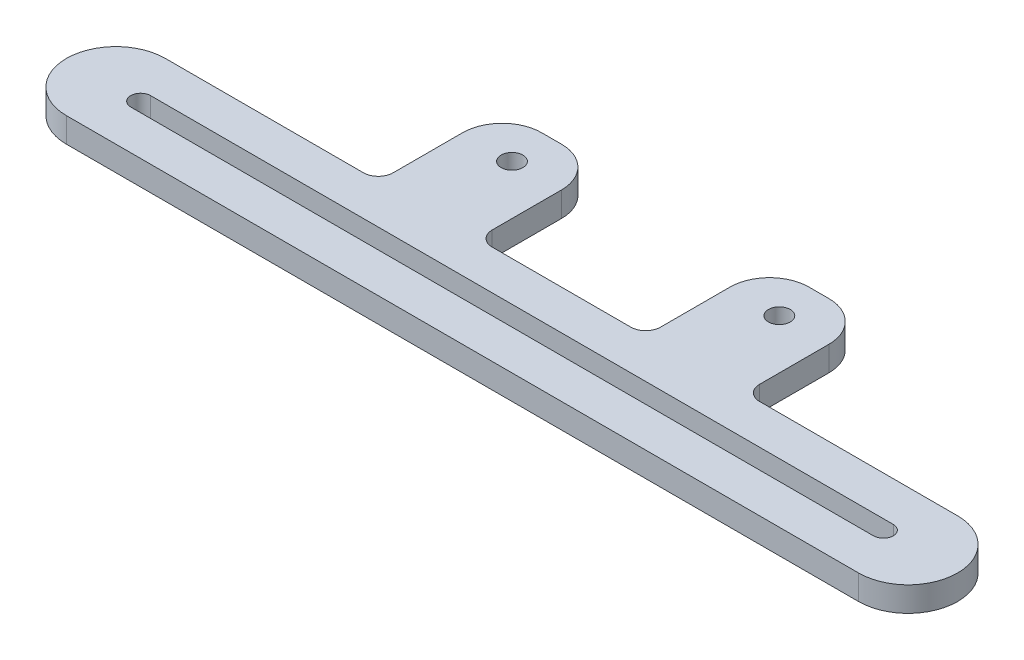
ISO-10303-21;
HEADER;
FILE_DESCRIPTION(('STEP AP214'),'2;1');
FILE_NAME('part.step','',(''),(''),'','','');
FILE_SCHEMA(('AUTOMOTIVE_DESIGN { 1 0 10303 214 1 1 1 1 }'));
ENDSEC;
DATA;
#1=APPLICATION_CONTEXT('core data for automotive mechanical design processes');
#2=APPLICATION_PROTOCOL_DEFINITION('international standard','automotive_design',2000,#1);
#3=PRODUCT_CONTEXT('',#1,'mechanical');
#4=PRODUCT('Part','Part','',(#3));
#5=PRODUCT_RELATED_PRODUCT_CATEGORY('part','',(#4));
#6=PRODUCT_DEFINITION_FORMATION('','',#4);
#7=PRODUCT_DEFINITION_CONTEXT('part definition',#1,'design');
#8=PRODUCT_DEFINITION('design','',#6,#7);
#9=PRODUCT_DEFINITION_SHAPE('','',#8);
#10=(LENGTH_UNIT() NAMED_UNIT(*) SI_UNIT(.MILLI.,.METRE.));
#11=(NAMED_UNIT(*) PLANE_ANGLE_UNIT() SI_UNIT($,.RADIAN.));
#12=(NAMED_UNIT(*) SI_UNIT($,.STERADIAN.) SOLID_ANGLE_UNIT());
#13=UNCERTAINTY_MEASURE_WITH_UNIT(LENGTH_MEASURE(1.E-05),#10,'distance_accuracy_value','');
#14=(GEOMETRIC_REPRESENTATION_CONTEXT(3) GLOBAL_UNCERTAINTY_ASSIGNED_CONTEXT((#13)) GLOBAL_UNIT_ASSIGNED_CONTEXT((#10,
#11,#12)) REPRESENTATION_CONTEXT('',''));
#15=CARTESIAN_POINT('',(0.,0.,0.));
#16=DIRECTION('',(0.,0.,1.));
#17=DIRECTION('',(1.,0.,0.));
#18=AXIS2_PLACEMENT_3D('',#15,#16,#17);
#19=CARTESIAN_POINT('',(0.,5.,0.));
#20=DIRECTION('',(0.,1.,0.));
#21=DIRECTION('',(0.,0.,1.));
#22=AXIS2_PLACEMENT_3D('',#19,#20,#21);
#23=PLANE('',#22);
#24=CARTESIAN_POINT('',(53.,5.,-27.));
#25=DIRECTION('',(0.,1.,0.));
#26=DIRECTION('',(0.,0.,1.));
#27=AXIS2_PLACEMENT_3D('',#24,#25,#26);
#28=CIRCLE('',#27,2.2);
#29=CARTESIAN_POINT('',(53.,5.,-24.8));
#30=VERTEX_POINT('',#29);
#31=EDGE_CURVE('E241',#30,#30,#28,.T.);
#32=ORIENTED_EDGE('',*,*,#31,.F.);
#33=EDGE_LOOP('',(#32));
#34=FACE_BOUND('',#33,.T.);
#35=CARTESIAN_POINT('',(0.,5.,0.));
#36=DIRECTION('',(0.,1.,0.));
#37=DIRECTION('',(0.,0.,1.));
#38=AXIS2_PLACEMENT_3D('',#35,#36,#37);
#39=CIRCLE('',#38,10.);
#40=CARTESIAN_POINT('',(0.,5.,-10.));
#41=VERTEX_POINT('',#40);
#42=CARTESIAN_POINT('',(0.,5.,10.));
#43=VERTEX_POINT('',#42);
#44=EDGE_CURVE('E258',#41,#43,#39,.T.);
#45=ORIENTED_EDGE('',*,*,#44,.T.);
#46=DIRECTION('',(1.,0.,0.));
#47=VECTOR('',#46,1.);
#48=CARTESIAN_POINT('',(0.,5.,10.));
#49=LINE('',#48,#47);
#50=CARTESIAN_POINT('',(160.,5.,10.));
#51=VERTEX_POINT('',#50);
#52=EDGE_CURVE('E262',#43,#51,#49,.T.);
#53=ORIENTED_EDGE('',*,*,#52,.T.);
#54=CARTESIAN_POINT('',(160.,5.,0.));
#55=DIRECTION('',(0.,1.,0.));
#56=DIRECTION('',(0.,0.,1.));
#57=AXIS2_PLACEMENT_3D('',#54,#55,#56);
#58=CIRCLE('',#57,10.);
#59=CARTESIAN_POINT('',(160.,5.,-10.));
#60=VERTEX_POINT('',#59);
#61=EDGE_CURVE('E266',#51,#60,#58,.T.);
#62=ORIENTED_EDGE('',*,*,#61,.T.);
#63=DIRECTION('',(-1.,0.,0.));
#64=VECTOR('',#63,1.);
#65=CARTESIAN_POINT('',(117.,5.,-10.));
#66=LINE('',#65,#64);
#67=CARTESIAN_POINT('',(120.,5.,-10.));
#68=VERTEX_POINT('',#67);
#69=EDGE_CURVE('E269',#60,#68,#66,.T.);
#70=ORIENTED_EDGE('',*,*,#69,.T.);
#71=CARTESIAN_POINT('',(120.,5.,-13.));
#72=DIRECTION('',(0.,1.,0.));
#73=DIRECTION('',(0.,0.,1.));
#74=AXIS2_PLACEMENT_3D('',#71,#72,#73);
#75=CIRCLE('',#74,3.);
#76=CARTESIAN_POINT('',(117.,5.,-13.));
#77=VERTEX_POINT('',#76);
#78=EDGE_CURVE('E439',#68,#77,#75,.F.);
#79=ORIENTED_EDGE('',*,*,#78,.T.);
#80=DIRECTION('',(0.,0.,-1.));
#81=VECTOR('',#80,1.);
#82=CARTESIAN_POINT('',(117.,5.,-10.));
#83=LINE('',#82,#81);
#84=CARTESIAN_POINT('',(117.,5.,-26.9999999999999));
#85=VERTEX_POINT('',#84);
#86=EDGE_CURVE('E273',#77,#85,#83,.T.);
#87=ORIENTED_EDGE('',*,*,#86,.T.);
#88=CARTESIAN_POINT('',(109.,5.,-27.));
#89=DIRECTION('',(0.,1.,0.));
#90=DIRECTION('',(0.,0.,-1.));
#91=AXIS2_PLACEMENT_3D('',#88,#89,#90);
#92=CIRCLE('',#91,8.);
#93=CARTESIAN_POINT('',(109.,5.,-35.));
#94=VERTEX_POINT('',#93);
#95=EDGE_CURVE('E276',#85,#94,#92,.T.);
#96=ORIENTED_EDGE('',*,*,#95,.T.);
#97=DIRECTION('',(-1.,0.,0.));
#98=VECTOR('',#97,1.);
#99=CARTESIAN_POINT('',(105.,5.,-35.));
#100=LINE('',#99,#98);
#101=CARTESIAN_POINT('',(105.,5.,-35.));
#102=VERTEX_POINT('',#101);
#103=EDGE_CURVE('E279',#94,#102,#100,.T.);
#104=ORIENTED_EDGE('',*,*,#103,.T.);
#105=CARTESIAN_POINT('',(105.,5.,-27.));
#106=DIRECTION('',(0.,1.,0.));
#107=DIRECTION('',(0.,0.,-1.));
#108=AXIS2_PLACEMENT_3D('',#105,#106,#107);
#109=CIRCLE('',#108,8.);
#110=CARTESIAN_POINT('',(97.,5.,-26.9999999999999));
#111=VERTEX_POINT('',#110);
#112=EDGE_CURVE('E282',#102,#111,#109,.T.);
#113=ORIENTED_EDGE('',*,*,#112,.T.);
#114=DIRECTION('',(0.,0.,1.));
#115=VECTOR('',#114,1.);
#116=CARTESIAN_POINT('',(97.,5.,-10.));
#117=LINE('',#116,#115);
#118=CARTESIAN_POINT('',(97.,5.,-13.));
#119=VERTEX_POINT('',#118);
#120=EDGE_CURVE('E285',#111,#119,#117,.T.);
#121=ORIENTED_EDGE('',*,*,#120,.T.);
#122=CARTESIAN_POINT('',(94.,5.,-13.));
#123=DIRECTION('',(0.,1.,0.));
#124=DIRECTION('',(0.,0.,1.));
#125=AXIS2_PLACEMENT_3D('',#122,#123,#124);
#126=CIRCLE('',#125,3.);
#127=CARTESIAN_POINT('',(94.,5.,-10.));
#128=VERTEX_POINT('',#127);
#129=EDGE_CURVE('E445',#119,#128,#126,.F.);
#130=ORIENTED_EDGE('',*,*,#129,.T.);
#131=DIRECTION('',(-1.,0.,0.));
#132=VECTOR('',#131,1.);
#133=CARTESIAN_POINT('',(63.,5.,-10.));
#134=LINE('',#133,#132);
#135=CARTESIAN_POINT('',(66.,5.,-10.));
#136=VERTEX_POINT('',#135);
#137=EDGE_CURVE('E289',#128,#136,#134,.T.);
#138=ORIENTED_EDGE('',*,*,#137,.T.);
#139=CARTESIAN_POINT('',(66.,5.,-13.));
#140=DIRECTION('',(0.,1.,0.));
#141=DIRECTION('',(0.,0.,1.));
#142=AXIS2_PLACEMENT_3D('',#139,#140,#141);
#143=CIRCLE('',#142,3.);
#144=CARTESIAN_POINT('',(63.,5.,-13.));
#145=VERTEX_POINT('',#144);
#146=EDGE_CURVE('E451',#136,#145,#143,.F.);
#147=ORIENTED_EDGE('',*,*,#146,.T.);
#148=DIRECTION('',(0.,0.,-1.));
#149=VECTOR('',#148,1.);
#150=CARTESIAN_POINT('',(63.,5.,-10.));
#151=LINE('',#150,#149);
#152=CARTESIAN_POINT('',(63.,5.,-26.9999999999999));
#153=VERTEX_POINT('',#152);
#154=EDGE_CURVE('E293',#145,#153,#151,.T.);
#155=ORIENTED_EDGE('',*,*,#154,.T.);
#156=CARTESIAN_POINT('',(55.,5.,-27.));
#157=DIRECTION('',(0.,1.,0.));
#158=DIRECTION('',(0.,0.,-1.));
#159=AXIS2_PLACEMENT_3D('',#156,#157,#158);
#160=CIRCLE('',#159,8.);
#161=CARTESIAN_POINT('',(54.9999999999999,5.,-35.));
#162=VERTEX_POINT('',#161);
#163=EDGE_CURVE('E296',#153,#162,#160,.T.);
#164=ORIENTED_EDGE('',*,*,#163,.T.);
#165=DIRECTION('',(-1.,0.,0.));
#166=VECTOR('',#165,1.);
#167=CARTESIAN_POINT('',(51.,5.,-35.));
#168=LINE('',#167,#166);
#169=CARTESIAN_POINT('',(51.,5.,-35.));
#170=VERTEX_POINT('',#169);
#171=EDGE_CURVE('E299',#162,#170,#168,.T.);
#172=ORIENTED_EDGE('',*,*,#171,.T.);
#173=CARTESIAN_POINT('',(51.,5.,-27.));
#174=DIRECTION('',(0.,1.,0.));
#175=DIRECTION('',(0.,0.,-1.));
#176=AXIS2_PLACEMENT_3D('',#173,#174,#175);
#177=CIRCLE('',#176,8.);
#178=CARTESIAN_POINT('',(43.,5.,-26.9999999999999));
#179=VERTEX_POINT('',#178);
#180=EDGE_CURVE('E302',#170,#179,#177,.T.);
#181=ORIENTED_EDGE('',*,*,#180,.T.);
#182=DIRECTION('',(0.,0.,1.));
#183=VECTOR('',#182,1.);
#184=CARTESIAN_POINT('',(43.,5.,-10.));
#185=LINE('',#184,#183);
#186=CARTESIAN_POINT('',(43.,5.,-13.));
#187=VERTEX_POINT('',#186);
#188=EDGE_CURVE('E305',#179,#187,#185,.T.);
#189=ORIENTED_EDGE('',*,*,#188,.T.);
#190=CARTESIAN_POINT('',(40.,5.,-13.));
#191=DIRECTION('',(0.,1.,0.));
#192=DIRECTION('',(0.,0.,1.));
#193=AXIS2_PLACEMENT_3D('',#190,#191,#192);
#194=CIRCLE('',#193,3.);
#195=CARTESIAN_POINT('',(40.,5.,-10.));
#196=VERTEX_POINT('',#195);
#197=EDGE_CURVE('E11',#187,#196,#194,.F.);
#198=ORIENTED_EDGE('',*,*,#197,.T.);
#199=DIRECTION('',(-1.,0.,0.));
#200=VECTOR('',#199,1.);
#201=CARTESIAN_POINT('',(0.,5.,-10.));
#202=LINE('',#201,#200);
#203=EDGE_CURVE('E308',#196,#41,#202,.T.);
#204=ORIENTED_EDGE('',*,*,#203,.T.);
#205=EDGE_LOOP('',(#45,#53,#62,#70,#79,#87,#96,#104,#113,#121,#130,#138,#147,#155,#164,#172,
#181,#189,#198,#204));
#206=FACE_BOUND('',#205,.T.);
#207=DIRECTION('',(1.,0.,0.));
#208=VECTOR('',#207,1.);
#209=CARTESIAN_POINT('',(5.,5.,2.));
#210=LINE('',#209,#208);
#211=CARTESIAN_POINT('',(5.,5.,2.));
#212=VERTEX_POINT('',#211);
#213=CARTESIAN_POINT('',(155.,5.,2.));
#214=VERTEX_POINT('',#213);
#215=EDGE_CURVE('E213',#212,#214,#210,.T.);
#216=ORIENTED_EDGE('',*,*,#215,.F.);
#217=CARTESIAN_POINT('',(5.,5.,0.));
#218=DIRECTION('',(0.,1.,0.));
#219=DIRECTION('',(0.,0.,1.));
#220=AXIS2_PLACEMENT_3D('',#217,#218,#219);
#221=CIRCLE('',#220,2.);
#222=CARTESIAN_POINT('',(5.,5.,-2.));
#223=VERTEX_POINT('',#222);
#224=EDGE_CURVE('E202',#223,#212,#221,.T.);
#225=ORIENTED_EDGE('',*,*,#224,.F.);
#226=DIRECTION('',(-1.,0.,0.));
#227=VECTOR('',#226,1.);
#228=CARTESIAN_POINT('',(5.,5.,-2.));
#229=LINE('',#228,#227);
#230=CARTESIAN_POINT('',(155.,5.,-2.));
#231=VERTEX_POINT('',#230);
#232=EDGE_CURVE('E232',#231,#223,#229,.T.);
#233=ORIENTED_EDGE('',*,*,#232,.F.);
#234=CARTESIAN_POINT('',(155.,5.,0.));
#235=DIRECTION('',(0.,1.,0.));
#236=DIRECTION('',(0.,0.,1.));
#237=AXIS2_PLACEMENT_3D('',#234,#235,#236);
#238=CIRCLE('',#237,2.);
#239=EDGE_CURVE('E228',#214,#231,#238,.T.);
#240=ORIENTED_EDGE('',*,*,#239,.F.);
#241=EDGE_LOOP('',(#216,#225,#233,#240));
#242=FACE_BOUND('',#241,.T.);
#243=CARTESIAN_POINT('',(107.,5.,-27.));
#244=DIRECTION('',(0.,1.,0.));
#245=DIRECTION('',(0.,0.,1.));
#246=AXIS2_PLACEMENT_3D('',#243,#244,#245);
#247=CIRCLE('',#246,2.2);
#248=CARTESIAN_POINT('',(107.,5.,-24.8));
#249=VERTEX_POINT('',#248);
#250=EDGE_CURVE('E780',#249,#249,#247,.T.);
#251=ORIENTED_EDGE('',*,*,#250,.F.);
#252=EDGE_LOOP('',(#251));
#253=FACE_BOUND('',#252,.T.);
#254=ADVANCED_FACE('F39',(#34,#206,#242,#253),#23,.T.);
#255=CARTESIAN_POINT('',(0.,0.,0.));
#256=DIRECTION('',(0.,1.,0.));
#257=DIRECTION('',(0.,0.,1.));
#258=AXIS2_PLACEMENT_3D('',#255,#256,#257);
#259=PLANE('',#258);
#260=CARTESIAN_POINT('',(0.,0.,0.));
#261=DIRECTION('',(0.,1.,0.));
#262=DIRECTION('',(0.,0.,1.));
#263=AXIS2_PLACEMENT_3D('',#260,#261,#262);
#264=CIRCLE('',#263,10.);
#265=CARTESIAN_POINT('',(0.,0.,-10.));
#266=VERTEX_POINT('',#265);
#267=CARTESIAN_POINT('',(0.,0.,10.));
#268=VERTEX_POINT('',#267);
#269=EDGE_CURVE('E222',#266,#268,#264,.T.);
#270=ORIENTED_EDGE('',*,*,#269,.F.);
#271=DIRECTION('',(-1.,0.,0.));
#272=VECTOR('',#271,1.);
#273=CARTESIAN_POINT('',(0.,0.,-10.));
#274=LINE('',#273,#272);
#275=CARTESIAN_POINT('',(40.,0.,-10.));
#276=VERTEX_POINT('',#275);
#277=EDGE_CURVE('E263',#276,#266,#274,.T.);
#278=ORIENTED_EDGE('',*,*,#277,.F.);
#279=CARTESIAN_POINT('',(40.,0.,-13.));
#280=DIRECTION('',(0.,1.,0.));
#281=DIRECTION('',(0.,0.,1.));
#282=AXIS2_PLACEMENT_3D('',#279,#280,#281);
#283=CIRCLE('',#282,3.);
#284=CARTESIAN_POINT('',(43.,0.,-13.));
#285=VERTEX_POINT('',#284);
#286=EDGE_CURVE('E48',#276,#285,#283,.T.);
#287=ORIENTED_EDGE('',*,*,#286,.T.);
#288=DIRECTION('',(0.,0.,1.));
#289=VECTOR('',#288,1.);
#290=CARTESIAN_POINT('',(43.,0.,-10.));
#291=LINE('',#290,#289);
#292=CARTESIAN_POINT('',(43.,0.,-26.9999999999999));
#293=VERTEX_POINT('',#292);
#294=EDGE_CURVE('E357',#293,#285,#291,.T.);
#295=ORIENTED_EDGE('',*,*,#294,.F.);
#296=CARTESIAN_POINT('',(51.,0.,-27.));
#297=DIRECTION('',(0.,1.,0.));
#298=DIRECTION('',(0.,0.,-1.));
#299=AXIS2_PLACEMENT_3D('',#296,#297,#298);
#300=CIRCLE('',#299,8.);
#301=CARTESIAN_POINT('',(51.,0.,-35.));
#302=VERTEX_POINT('',#301);
#303=EDGE_CURVE('E354',#302,#293,#300,.T.);
#304=ORIENTED_EDGE('',*,*,#303,.F.);
#305=DIRECTION('',(-1.,0.,0.));
#306=VECTOR('',#305,1.);
#307=CARTESIAN_POINT('',(51.,0.,-35.));
#308=LINE('',#307,#306);
#309=CARTESIAN_POINT('',(54.9999999999999,0.,-35.));
#310=VERTEX_POINT('',#309);
#311=EDGE_CURVE('E351',#310,#302,#308,.T.);
#312=ORIENTED_EDGE('',*,*,#311,.F.);
#313=CARTESIAN_POINT('',(55.,0.,-27.));
#314=DIRECTION('',(0.,1.,0.));
#315=DIRECTION('',(0.,0.,-1.));
#316=AXIS2_PLACEMENT_3D('',#313,#314,#315);
#317=CIRCLE('',#316,8.);
#318=CARTESIAN_POINT('',(63.,0.,-26.9999999999999));
#319=VERTEX_POINT('',#318);
#320=EDGE_CURVE('E348',#319,#310,#317,.T.);
#321=ORIENTED_EDGE('',*,*,#320,.F.);
#322=DIRECTION('',(0.,0.,-1.));
#323=VECTOR('',#322,1.);
#324=CARTESIAN_POINT('',(63.,0.,-10.));
#325=LINE('',#324,#323);
#326=CARTESIAN_POINT('',(63.,0.,-13.));
#327=VERTEX_POINT('',#326);
#328=EDGE_CURVE('E345',#327,#319,#325,.T.);
#329=ORIENTED_EDGE('',*,*,#328,.F.);
#330=CARTESIAN_POINT('',(66.,0.,-13.));
#331=DIRECTION('',(0.,1.,0.));
#332=DIRECTION('',(0.,0.,1.));
#333=AXIS2_PLACEMENT_3D('',#330,#331,#332);
#334=CIRCLE('',#333,3.);
#335=CARTESIAN_POINT('',(66.,0.,-10.));
#336=VERTEX_POINT('',#335);
#337=EDGE_CURVE('E448',#327,#336,#334,.T.);
#338=ORIENTED_EDGE('',*,*,#337,.T.);
#339=DIRECTION('',(-1.,0.,0.));
#340=VECTOR('',#339,1.);
#341=CARTESIAN_POINT('',(63.,0.,-10.));
#342=LINE('',#341,#340);
#343=CARTESIAN_POINT('',(94.,0.,-10.));
#344=VERTEX_POINT('',#343);
#345=EDGE_CURVE('E341',#344,#336,#342,.T.);
#346=ORIENTED_EDGE('',*,*,#345,.F.);
#347=CARTESIAN_POINT('',(94.,0.,-13.));
#348=DIRECTION('',(0.,1.,0.));
#349=DIRECTION('',(0.,0.,1.));
#350=AXIS2_PLACEMENT_3D('',#347,#348,#349);
#351=CIRCLE('',#350,3.);
#352=CARTESIAN_POINT('',(97.,0.,-13.));
#353=VERTEX_POINT('',#352);
#354=EDGE_CURVE('E442',#344,#353,#351,.T.);
#355=ORIENTED_EDGE('',*,*,#354,.T.);
#356=DIRECTION('',(0.,0.,1.));
#357=VECTOR('',#356,1.);
#358=CARTESIAN_POINT('',(97.,0.,-10.));
#359=LINE('',#358,#357);
#360=CARTESIAN_POINT('',(97.,0.,-26.9999999999999));
#361=VERTEX_POINT('',#360);
#362=EDGE_CURVE('E337',#361,#353,#359,.T.);
#363=ORIENTED_EDGE('',*,*,#362,.F.);
#364=CARTESIAN_POINT('',(105.,0.,-27.));
#365=DIRECTION('',(0.,1.,0.));
#366=DIRECTION('',(0.,0.,-1.));
#367=AXIS2_PLACEMENT_3D('',#364,#365,#366);
#368=CIRCLE('',#367,8.);
#369=CARTESIAN_POINT('',(105.,0.,-35.));
#370=VERTEX_POINT('',#369);
#371=EDGE_CURVE('E334',#370,#361,#368,.T.);
#372=ORIENTED_EDGE('',*,*,#371,.F.);
#373=DIRECTION('',(-1.,0.,0.));
#374=VECTOR('',#373,1.);
#375=CARTESIAN_POINT('',(105.,0.,-35.));
#376=LINE('',#375,#374);
#377=CARTESIAN_POINT('',(109.,0.,-35.));
#378=VERTEX_POINT('',#377);
#379=EDGE_CURVE('E331',#378,#370,#376,.T.);
#380=ORIENTED_EDGE('',*,*,#379,.F.);
#381=CARTESIAN_POINT('',(109.,0.,-27.));
#382=DIRECTION('',(0.,1.,0.));
#383=DIRECTION('',(0.,0.,-1.));
#384=AXIS2_PLACEMENT_3D('',#381,#382,#383);
#385=CIRCLE('',#384,8.);
#386=CARTESIAN_POINT('',(117.,0.,-26.9999999999999));
#387=VERTEX_POINT('',#386);
#388=EDGE_CURVE('E328',#387,#378,#385,.T.);
#389=ORIENTED_EDGE('',*,*,#388,.F.);
#390=DIRECTION('',(0.,0.,-1.));
#391=VECTOR('',#390,1.);
#392=CARTESIAN_POINT('',(117.,0.,-10.));
#393=LINE('',#392,#391);
#394=CARTESIAN_POINT('',(117.,0.,-13.));
#395=VERTEX_POINT('',#394);
#396=EDGE_CURVE('E325',#395,#387,#393,.T.);
#397=ORIENTED_EDGE('',*,*,#396,.F.);
#398=CARTESIAN_POINT('',(120.,0.,-13.));
#399=DIRECTION('',(0.,1.,0.));
#400=DIRECTION('',(0.,0.,1.));
#401=AXIS2_PLACEMENT_3D('',#398,#399,#400);
#402=CIRCLE('',#401,3.);
#403=CARTESIAN_POINT('',(120.,0.,-10.));
#404=VERTEX_POINT('',#403);
#405=EDGE_CURVE('E436',#395,#404,#402,.T.);
#406=ORIENTED_EDGE('',*,*,#405,.T.);
#407=DIRECTION('',(-1.,0.,0.));
#408=VECTOR('',#407,1.);
#409=CARTESIAN_POINT('',(117.,0.,-10.));
#410=LINE('',#409,#408);
#411=CARTESIAN_POINT('',(160.,0.,-10.));
#412=VERTEX_POINT('',#411);
#413=EDGE_CURVE('E321',#412,#404,#410,.T.);
#414=ORIENTED_EDGE('',*,*,#413,.F.);
#415=CARTESIAN_POINT('',(160.,0.,0.));
#416=DIRECTION('',(0.,1.,0.));
#417=DIRECTION('',(0.,0.,1.));
#418=AXIS2_PLACEMENT_3D('',#415,#416,#417);
#419=CIRCLE('',#418,10.);
#420=CARTESIAN_POINT('',(160.,0.,10.));
#421=VERTEX_POINT('',#420);
#422=EDGE_CURVE('E318',#421,#412,#419,.T.);
#423=ORIENTED_EDGE('',*,*,#422,.F.);
#424=DIRECTION('',(1.,0.,0.));
#425=VECTOR('',#424,1.);
#426=CARTESIAN_POINT('',(0.,0.,10.));
#427=LINE('',#426,#425);
#428=EDGE_CURVE('E315',#268,#421,#427,.T.);
#429=ORIENTED_EDGE('',*,*,#428,.F.);
#430=EDGE_LOOP('',(#270,#278,#287,#295,#304,#312,#321,#329,#338,#346,#355,#363,#372,#380,#389,
#397,#406,#414,#423,#429));
#431=FACE_BOUND('',#430,.T.);
#432=CARTESIAN_POINT('',(5.,0.,0.));
#433=DIRECTION('',(0.,1.,0.));
#434=DIRECTION('',(0.,0.,1.));
#435=AXIS2_PLACEMENT_3D('',#432,#433,#434);
#436=CIRCLE('',#435,2.);
#437=CARTESIAN_POINT('',(5.,0.,-2.));
#438=VERTEX_POINT('',#437);
#439=CARTESIAN_POINT('',(5.,0.,2.));
#440=VERTEX_POINT('',#439);
#441=EDGE_CURVE('E238',#438,#440,#436,.T.);
#442=ORIENTED_EDGE('',*,*,#441,.T.);
#443=DIRECTION('',(1.,0.,0.));
#444=VECTOR('',#443,1.);
#445=CARTESIAN_POINT('',(5.,0.,2.));
#446=LINE('',#445,#444);
#447=CARTESIAN_POINT('',(155.,0.,2.));
#448=VERTEX_POINT('',#447);
#449=EDGE_CURVE('E220',#440,#448,#446,.T.);
#450=ORIENTED_EDGE('',*,*,#449,.T.);
#451=CARTESIAN_POINT('',(155.,0.,0.));
#452=DIRECTION('',(0.,1.,0.));
#453=DIRECTION('',(0.,0.,1.));
#454=AXIS2_PLACEMENT_3D('',#451,#452,#453);
#455=CIRCLE('',#454,2.);
#456=CARTESIAN_POINT('',(155.,0.,-2.));
#457=VERTEX_POINT('',#456);
#458=EDGE_CURVE('E244',#448,#457,#455,.T.);
#459=ORIENTED_EDGE('',*,*,#458,.T.);
#460=DIRECTION('',(-1.,0.,0.));
#461=VECTOR('',#460,1.);
#462=CARTESIAN_POINT('',(5.,0.,-2.));
#463=LINE('',#462,#461);
#464=EDGE_CURVE('E214',#457,#438,#463,.T.);
#465=ORIENTED_EDGE('',*,*,#464,.T.);
#466=EDGE_LOOP('',(#442,#450,#459,#465));
#467=FACE_BOUND('',#466,.T.);
#468=CARTESIAN_POINT('',(53.,0.,-27.));
#469=DIRECTION('',(0.,1.,0.));
#470=DIRECTION('',(0.,0.,1.));
#471=AXIS2_PLACEMENT_3D('',#468,#469,#470);
#472=CIRCLE('',#471,2.2);
#473=CARTESIAN_POINT('',(53.,0.,-24.8));
#474=VERTEX_POINT('',#473);
#475=EDGE_CURVE('E788',#474,#474,#472,.T.);
#476=ORIENTED_EDGE('',*,*,#475,.T.);
#477=EDGE_LOOP('',(#476));
#478=FACE_BOUND('',#477,.T.);
#479=CARTESIAN_POINT('',(107.,0.,-27.));
#480=DIRECTION('',(0.,1.,0.));
#481=DIRECTION('',(0.,0.,1.));
#482=AXIS2_PLACEMENT_3D('',#479,#480,#481);
#483=CIRCLE('',#482,2.2);
#484=CARTESIAN_POINT('',(107.,0.,-24.8));
#485=VERTEX_POINT('',#484);
#486=EDGE_CURVE('E783',#485,#485,#483,.T.);
#487=ORIENTED_EDGE('',*,*,#486,.T.);
#488=EDGE_LOOP('',(#487));
#489=FACE_BOUND('',#488,.T.);
#490=ADVANCED_FACE('F469',(#431,#467,#478,#489),#259,.F.);
#491=CARTESIAN_POINT('',(0.,5.,0.));
#492=DIRECTION('',(0.,-1.,0.));
#493=DIRECTION('',(0.,0.,-1.));
#494=AXIS2_PLACEMENT_3D('',#491,#492,#493);
#495=CYLINDRICAL_SURFACE('',#494,10.);
#496=ORIENTED_EDGE('',*,*,#269,.T.);
#497=DIRECTION('',(0.,-1.,0.));
#498=VECTOR('',#497,1.);
#499=CARTESIAN_POINT('',(0.,5.,10.));
#500=LINE('',#499,#498);
#501=EDGE_CURVE('E405',#43,#268,#500,.T.);
#502=ORIENTED_EDGE('',*,*,#501,.F.);
#503=ORIENTED_EDGE('',*,*,#44,.F.);
#504=DIRECTION('',(0.,-1.,0.));
#505=VECTOR('',#504,1.);
#506=CARTESIAN_POINT('',(0.,5.,-10.));
#507=LINE('',#506,#505);
#508=EDGE_CURVE('E311',#41,#266,#507,.T.);
#509=ORIENTED_EDGE('',*,*,#508,.T.);
#510=EDGE_LOOP('',(#496,#502,#503,#509));
#511=FACE_BOUND('',#510,.T.);
#512=ADVANCED_FACE('F523',(#511),#495,.T.);
#513=CARTESIAN_POINT('',(0.,5.,10.));
#514=DIRECTION('',(0.,0.,-1.));
#515=DIRECTION('',(-1.,0.,0.));
#516=AXIS2_PLACEMENT_3D('',#513,#514,#515);
#517=PLANE('',#516);
#518=ORIENTED_EDGE('',*,*,#428,.T.);
#519=DIRECTION('',(0.,-1.,0.));
#520=VECTOR('',#519,1.);
#521=CARTESIAN_POINT('',(160.,5.,10.));
#522=LINE('',#521,#520);
#523=EDGE_CURVE('E401',#51,#421,#522,.T.);
#524=ORIENTED_EDGE('',*,*,#523,.F.);
#525=ORIENTED_EDGE('',*,*,#52,.F.);
#526=ORIENTED_EDGE('',*,*,#501,.T.);
#527=EDGE_LOOP('',(#518,#524,#525,#526));
#528=FACE_BOUND('',#527,.T.);
#529=ADVANCED_FACE('F520',(#528),#517,.F.);
#530=CARTESIAN_POINT('',(160.,5.,0.));
#531=DIRECTION('',(0.,-1.,0.));
#532=DIRECTION('',(0.,0.,-1.));
#533=AXIS2_PLACEMENT_3D('',#530,#531,#532);
#534=CYLINDRICAL_SURFACE('',#533,10.);
#535=ORIENTED_EDGE('',*,*,#422,.T.);
#536=DIRECTION('',(0.,-1.,0.));
#537=VECTOR('',#536,1.);
#538=CARTESIAN_POINT('',(160.,5.,-10.));
#539=LINE('',#538,#537);
#540=EDGE_CURVE('E397',#60,#412,#539,.T.);
#541=ORIENTED_EDGE('',*,*,#540,.F.);
#542=ORIENTED_EDGE('',*,*,#61,.F.);
#543=ORIENTED_EDGE('',*,*,#523,.T.);
#544=EDGE_LOOP('',(#535,#541,#542,#543));
#545=FACE_BOUND('',#544,.T.);
#546=ADVANCED_FACE('F517',(#545),#534,.T.);
#547=CARTESIAN_POINT('',(117.,5.,-10.));
#548=DIRECTION('',(0.,0.,1.));
#549=DIRECTION('',(1.,0.,0.));
#550=AXIS2_PLACEMENT_3D('',#547,#548,#549);
#551=PLANE('',#550);
#552=ORIENTED_EDGE('',*,*,#413,.T.);
#553=DIRECTION('',(0.,-1.,0.));
#554=VECTOR('',#553,1.);
#555=CARTESIAN_POINT('',(120.,5.,-10.));
#556=LINE('',#555,#554);
#557=EDGE_CURVE('E413',#404,#68,#556,.F.);
#558=ORIENTED_EDGE('',*,*,#557,.T.);
#559=ORIENTED_EDGE('',*,*,#69,.F.);
#560=ORIENTED_EDGE('',*,*,#540,.T.);
#561=EDGE_LOOP('',(#552,#558,#559,#560));
#562=FACE_BOUND('',#561,.T.);
#563=ADVANCED_FACE('F509',(#562),#551,.F.);
#564=CARTESIAN_POINT('',(117.,5.,-10.));
#565=DIRECTION('',(-1.,0.,0.));
#566=DIRECTION('',(0.,0.,1.));
#567=AXIS2_PLACEMENT_3D('',#564,#565,#566);
#568=PLANE('',#567);
#569=ORIENTED_EDGE('',*,*,#86,.F.);
#570=DIRECTION('',(0.,-1.,0.));
#571=VECTOR('',#570,1.);
#572=CARTESIAN_POINT('',(117.,0.,-13.));
#573=LINE('',#572,#571);
#574=EDGE_CURVE('E409',#77,#395,#573,.T.);
#575=ORIENTED_EDGE('',*,*,#574,.T.);
#576=ORIENTED_EDGE('',*,*,#396,.T.);
#577=DIRECTION('',(0.,-1.,0.));
#578=VECTOR('',#577,1.);
#579=CARTESIAN_POINT('',(117.,5.,-26.9999999999999));
#580=LINE('',#579,#578);
#581=EDGE_CURVE('E393',#85,#387,#580,.T.);
#582=ORIENTED_EDGE('',*,*,#581,.F.);
#583=EDGE_LOOP('',(#569,#575,#576,#582));
#584=FACE_BOUND('',#583,.T.);
#585=ADVANCED_FACE('F502',(#584),#568,.F.);
#586=CARTESIAN_POINT('',(109.,5.,-27.));
#587=DIRECTION('',(0.,-1.,0.));
#588=DIRECTION('',(0.,0.,-1.));
#589=AXIS2_PLACEMENT_3D('',#586,#587,#588);
#590=CYLINDRICAL_SURFACE('',#589,8.);
#591=ORIENTED_EDGE('',*,*,#388,.T.);
#592=DIRECTION('',(0.,-1.,0.));
#593=VECTOR('',#592,1.);
#594=CARTESIAN_POINT('',(109.,5.,-35.));
#595=LINE('',#594,#593);
#596=EDGE_CURVE('E389',#94,#378,#595,.T.);
#597=ORIENTED_EDGE('',*,*,#596,.F.);
#598=ORIENTED_EDGE('',*,*,#95,.F.);
#599=ORIENTED_EDGE('',*,*,#581,.T.);
#600=EDGE_LOOP('',(#591,#597,#598,#599));
#601=FACE_BOUND('',#600,.T.);
#602=ADVANCED_FACE('F498',(#601),#590,.T.);
#603=CARTESIAN_POINT('',(105.,5.,-35.));
#604=DIRECTION('',(0.,0.,1.));
#605=DIRECTION('',(1.,0.,0.));
#606=AXIS2_PLACEMENT_3D('',#603,#604,#605);
#607=PLANE('',#606);
#608=ORIENTED_EDGE('',*,*,#379,.T.);
#609=DIRECTION('',(0.,-1.,0.));
#610=VECTOR('',#609,1.);
#611=CARTESIAN_POINT('',(105.,5.,-35.));
#612=LINE('',#611,#610);
#613=EDGE_CURVE('E385',#102,#370,#612,.T.);
#614=ORIENTED_EDGE('',*,*,#613,.F.);
#615=ORIENTED_EDGE('',*,*,#103,.F.);
#616=ORIENTED_EDGE('',*,*,#596,.T.);
#617=EDGE_LOOP('',(#608,#614,#615,#616));
#618=FACE_BOUND('',#617,.T.);
#619=ADVANCED_FACE('F493',(#618),#607,.F.);
#620=CARTESIAN_POINT('',(105.,5.,-27.));
#621=DIRECTION('',(0.,-1.,0.));
#622=DIRECTION('',(0.,0.,-1.));
#623=AXIS2_PLACEMENT_3D('',#620,#621,#622);
#624=CYLINDRICAL_SURFACE('',#623,8.);
#625=ORIENTED_EDGE('',*,*,#371,.T.);
#626=DIRECTION('',(0.,-1.,0.));
#627=VECTOR('',#626,1.);
#628=CARTESIAN_POINT('',(97.,5.,-26.9999999999999));
#629=LINE('',#628,#627);
#630=EDGE_CURVE('E381',#111,#361,#629,.T.);
#631=ORIENTED_EDGE('',*,*,#630,.F.);
#632=ORIENTED_EDGE('',*,*,#112,.F.);
#633=ORIENTED_EDGE('',*,*,#613,.T.);
#634=EDGE_LOOP('',(#625,#631,#632,#633));
#635=FACE_BOUND('',#634,.T.);
#636=ADVANCED_FACE('F487',(#635),#624,.T.);
#637=CARTESIAN_POINT('',(97.,5.,-10.));
#638=DIRECTION('',(1.,0.,0.));
#639=DIRECTION('',(0.,0.,-1.));
#640=AXIS2_PLACEMENT_3D('',#637,#638,#639);
#641=PLANE('',#640);
#642=ORIENTED_EDGE('',*,*,#362,.T.);
#643=DIRECTION('',(0.,-1.,0.));
#644=VECTOR('',#643,1.);
#645=CARTESIAN_POINT('',(97.,5.,-13.));
#646=LINE('',#645,#644);
#647=EDGE_CURVE('E423',#353,#119,#646,.F.);
#648=ORIENTED_EDGE('',*,*,#647,.T.);
#649=ORIENTED_EDGE('',*,*,#120,.F.);
#650=ORIENTED_EDGE('',*,*,#630,.T.);
#651=EDGE_LOOP('',(#642,#648,#649,#650));
#652=FACE_BOUND('',#651,.T.);
#653=ADVANCED_FACE('F482',(#652),#641,.F.);
#654=CARTESIAN_POINT('',(63.,5.,-10.));
#655=DIRECTION('',(0.,0.,1.));
#656=DIRECTION('',(1.,0.,0.));
#657=AXIS2_PLACEMENT_3D('',#654,#655,#656);
#658=PLANE('',#657);
#659=ORIENTED_EDGE('',*,*,#137,.F.);
#660=DIRECTION('',(0.,-1.,0.));
#661=VECTOR('',#660,1.);
#662=CARTESIAN_POINT('',(94.,0.,-10.));
#663=LINE('',#662,#661);
#664=EDGE_CURVE('E419',#128,#344,#663,.T.);
#665=ORIENTED_EDGE('',*,*,#664,.T.);
#666=ORIENTED_EDGE('',*,*,#345,.T.);
#667=DIRECTION('',(0.,-1.,0.));
#668=VECTOR('',#667,1.);
#669=CARTESIAN_POINT('',(66.,5.,-10.));
#670=LINE('',#669,#668);
#671=EDGE_CURVE('E416',#336,#136,#670,.F.);
#672=ORIENTED_EDGE('',*,*,#671,.T.);
#673=EDGE_LOOP('',(#659,#665,#666,#672));
#674=FACE_BOUND('',#673,.T.);
#675=ADVANCED_FACE('F473',(#674),#658,.F.);
#676=CARTESIAN_POINT('',(63.,5.,-10.));
#677=DIRECTION('',(-1.,0.,0.));
#678=DIRECTION('',(0.,0.,1.));
#679=AXIS2_PLACEMENT_3D('',#676,#677,#678);
#680=PLANE('',#679);
#681=ORIENTED_EDGE('',*,*,#154,.F.);
#682=DIRECTION('',(0.,-1.,0.));
#683=VECTOR('',#682,1.);
#684=CARTESIAN_POINT('',(63.,0.,-13.));
#685=LINE('',#684,#683);
#686=EDGE_CURVE('E426',#145,#327,#685,.T.);
#687=ORIENTED_EDGE('',*,*,#686,.T.);
#688=ORIENTED_EDGE('',*,*,#328,.T.);
#689=DIRECTION('',(0.,-1.,0.));
#690=VECTOR('',#689,1.);
#691=CARTESIAN_POINT('',(63.,5.,-26.9999999999999));
#692=LINE('',#691,#690);
#693=EDGE_CURVE('E377',#153,#319,#692,.T.);
#694=ORIENTED_EDGE('',*,*,#693,.F.);
#695=EDGE_LOOP('',(#681,#687,#688,#694));
#696=FACE_BOUND('',#695,.T.);
#697=ADVANCED_FACE('F463',(#696),#680,.F.);
#698=CARTESIAN_POINT('',(55.,5.,-27.));
#699=DIRECTION('',(0.,-1.,0.));
#700=DIRECTION('',(0.,0.,-1.));
#701=AXIS2_PLACEMENT_3D('',#698,#699,#700);
#702=CYLINDRICAL_SURFACE('',#701,8.);
#703=ORIENTED_EDGE('',*,*,#320,.T.);
#704=DIRECTION('',(0.,-1.,0.));
#705=VECTOR('',#704,1.);
#706=CARTESIAN_POINT('',(54.9999999999999,5.,-35.));
#707=LINE('',#706,#705);
#708=EDGE_CURVE('E373',#162,#310,#707,.T.);
#709=ORIENTED_EDGE('',*,*,#708,.F.);
#710=ORIENTED_EDGE('',*,*,#163,.F.);
#711=ORIENTED_EDGE('',*,*,#693,.T.);
#712=EDGE_LOOP('',(#703,#709,#710,#711));
#713=FACE_BOUND('',#712,.T.);
#714=ADVANCED_FACE('F544',(#713),#702,.T.);
#715=CARTESIAN_POINT('',(51.,5.,-35.));
#716=DIRECTION('',(0.,0.,1.));
#717=DIRECTION('',(1.,0.,0.));
#718=AXIS2_PLACEMENT_3D('',#715,#716,#717);
#719=PLANE('',#718);
#720=ORIENTED_EDGE('',*,*,#311,.T.);
#721=DIRECTION('',(0.,-1.,0.));
#722=VECTOR('',#721,1.);
#723=CARTESIAN_POINT('',(51.,5.,-35.));
#724=LINE('',#723,#722);
#725=EDGE_CURVE('E369',#170,#302,#724,.T.);
#726=ORIENTED_EDGE('',*,*,#725,.F.);
#727=ORIENTED_EDGE('',*,*,#171,.F.);
#728=ORIENTED_EDGE('',*,*,#708,.T.);
#729=EDGE_LOOP('',(#720,#726,#727,#728));
#730=FACE_BOUND('',#729,.T.);
#731=ADVANCED_FACE('F541',(#730),#719,.F.);
#732=CARTESIAN_POINT('',(51.,5.,-27.));
#733=DIRECTION('',(0.,-1.,0.));
#734=DIRECTION('',(0.,0.,-1.));
#735=AXIS2_PLACEMENT_3D('',#732,#733,#734);
#736=CYLINDRICAL_SURFACE('',#735,8.);
#737=ORIENTED_EDGE('',*,*,#303,.T.);
#738=DIRECTION('',(0.,-1.,0.));
#739=VECTOR('',#738,1.);
#740=CARTESIAN_POINT('',(43.,5.,-26.9999999999999));
#741=LINE('',#740,#739);
#742=EDGE_CURVE('E365',#179,#293,#741,.T.);
#743=ORIENTED_EDGE('',*,*,#742,.F.);
#744=ORIENTED_EDGE('',*,*,#180,.F.);
#745=ORIENTED_EDGE('',*,*,#725,.T.);
#746=EDGE_LOOP('',(#737,#743,#744,#745));
#747=FACE_BOUND('',#746,.T.);
#748=ADVANCED_FACE('F537',(#747),#736,.T.);
#749=CARTESIAN_POINT('',(43.,5.,-10.));
#750=DIRECTION('',(1.,0.,0.));
#751=DIRECTION('',(0.,0.,-1.));
#752=AXIS2_PLACEMENT_3D('',#749,#750,#751);
#753=PLANE('',#752);
#754=ORIENTED_EDGE('',*,*,#294,.T.);
#755=DIRECTION('',(0.,-1.,0.));
#756=VECTOR('',#755,1.);
#757=CARTESIAN_POINT('',(43.,5.,-13.));
#758=LINE('',#757,#756);
#759=EDGE_CURVE('E55',#285,#187,#758,.F.);
#760=ORIENTED_EDGE('',*,*,#759,.T.);
#761=ORIENTED_EDGE('',*,*,#188,.F.);
#762=ORIENTED_EDGE('',*,*,#742,.T.);
#763=EDGE_LOOP('',(#754,#760,#761,#762));
#764=FACE_BOUND('',#763,.T.);
#765=ADVANCED_FACE('F533',(#764),#753,.F.);
#766=CARTESIAN_POINT('',(0.,5.,-10.));
#767=DIRECTION('',(0.,0.,1.));
#768=DIRECTION('',(1.,0.,0.));
#769=AXIS2_PLACEMENT_3D('',#766,#767,#768);
#770=PLANE('',#769);
#771=ORIENTED_EDGE('',*,*,#203,.F.);
#772=DIRECTION('',(0.,-1.,0.));
#773=VECTOR('',#772,1.);
#774=CARTESIAN_POINT('',(40.,0.,-10.));
#775=LINE('',#774,#773);
#776=EDGE_CURVE('E430',#196,#276,#775,.T.);
#777=ORIENTED_EDGE('',*,*,#776,.T.);
#778=ORIENTED_EDGE('',*,*,#277,.T.);
#779=ORIENTED_EDGE('',*,*,#508,.F.);
#780=EDGE_LOOP('',(#771,#777,#778,#779));
#781=FACE_BOUND('',#780,.T.);
#782=ADVANCED_FACE('F527',(#781),#770,.F.);
#783=CARTESIAN_POINT('',(5.,5.,0.));
#784=DIRECTION('',(0.,-1.,0.));
#785=DIRECTION('',(0.,0.,-1.));
#786=AXIS2_PLACEMENT_3D('',#783,#784,#785);
#787=CYLINDRICAL_SURFACE('',#786,2.);
#788=ORIENTED_EDGE('',*,*,#441,.F.);
#789=DIRECTION('',(0.,-1.,0.));
#790=VECTOR('',#789,1.);
#791=CARTESIAN_POINT('',(5.,5.,-2.));
#792=LINE('',#791,#790);
#793=EDGE_CURVE('E208',#223,#438,#792,.T.);
#794=ORIENTED_EDGE('',*,*,#793,.F.);
#795=ORIENTED_EDGE('',*,*,#224,.T.);
#796=DIRECTION('',(0.,-1.,0.));
#797=VECTOR('',#796,1.);
#798=CARTESIAN_POINT('',(5.,5.,2.));
#799=LINE('',#798,#797);
#800=EDGE_CURVE('E205',#212,#440,#799,.T.);
#801=ORIENTED_EDGE('',*,*,#800,.T.);
#802=EDGE_LOOP('',(#788,#794,#795,#801));
#803=FACE_BOUND('',#802,.T.);
#804=ADVANCED_FACE('F204',(#803),#787,.F.);
#805=CARTESIAN_POINT('',(5.,5.,2.));
#806=DIRECTION('',(0.,0.,-1.));
#807=DIRECTION('',(-1.,0.,0.));
#808=AXIS2_PLACEMENT_3D('',#805,#806,#807);
#809=PLANE('',#808);
#810=ORIENTED_EDGE('',*,*,#449,.F.);
#811=ORIENTED_EDGE('',*,*,#800,.F.);
#812=ORIENTED_EDGE('',*,*,#215,.T.);
#813=DIRECTION('',(0.,-1.,0.));
#814=VECTOR('',#813,1.);
#815=CARTESIAN_POINT('',(155.,5.,2.));
#816=LINE('',#815,#814);
#817=EDGE_CURVE('E223',#214,#448,#816,.T.);
#818=ORIENTED_EDGE('',*,*,#817,.T.);
#819=EDGE_LOOP('',(#810,#811,#812,#818));
#820=FACE_BOUND('',#819,.T.);
#821=ADVANCED_FACE('F217',(#820),#809,.T.);
#822=CARTESIAN_POINT('',(155.,5.,0.));
#823=DIRECTION('',(0.,-1.,0.));
#824=DIRECTION('',(0.,0.,-1.));
#825=AXIS2_PLACEMENT_3D('',#822,#823,#824);
#826=CYLINDRICAL_SURFACE('',#825,2.);
#827=ORIENTED_EDGE('',*,*,#458,.F.);
#828=ORIENTED_EDGE('',*,*,#817,.F.);
#829=ORIENTED_EDGE('',*,*,#239,.T.);
#830=DIRECTION('',(0.,-1.,0.));
#831=VECTOR('',#830,1.);
#832=CARTESIAN_POINT('',(155.,5.,-2.));
#833=LINE('',#832,#831);
#834=EDGE_CURVE('E253',#231,#457,#833,.T.);
#835=ORIENTED_EDGE('',*,*,#834,.T.);
#836=EDGE_LOOP('',(#827,#828,#829,#835));
#837=FACE_BOUND('',#836,.T.);
#838=ADVANCED_FACE('F594',(#837),#826,.F.);
#839=CARTESIAN_POINT('',(5.,5.,-2.));
#840=DIRECTION('',(0.,0.,1.));
#841=DIRECTION('',(1.,0.,0.));
#842=AXIS2_PLACEMENT_3D('',#839,#840,#841);
#843=PLANE('',#842);
#844=ORIENTED_EDGE('',*,*,#464,.F.);
#845=ORIENTED_EDGE('',*,*,#834,.F.);
#846=ORIENTED_EDGE('',*,*,#232,.T.);
#847=ORIENTED_EDGE('',*,*,#793,.T.);
#848=EDGE_LOOP('',(#844,#845,#846,#847));
#849=FACE_BOUND('',#848,.T.);
#850=ADVANCED_FACE('F600',(#849),#843,.T.);
#851=CARTESIAN_POINT('',(53.,5.,-27.));
#852=DIRECTION('',(0.,-1.,0.));
#853=DIRECTION('',(0.,0.,-1.));
#854=AXIS2_PLACEMENT_3D('',#851,#852,#853);
#855=CYLINDRICAL_SURFACE('',#854,2.2);
#856=ORIENTED_EDGE('',*,*,#31,.T.);
#857=EDGE_LOOP('',(#856));
#858=FACE_BOUND('',#857,.T.);
#859=ORIENTED_EDGE('',*,*,#475,.F.);
#860=EDGE_LOOP('',(#859));
#861=FACE_BOUND('',#860,.T.);
#862=ADVANCED_FACE('F608',(#858,#861),#855,.F.);
#863=CARTESIAN_POINT('',(107.,5.,-27.));
#864=DIRECTION('',(0.,-1.,0.));
#865=DIRECTION('',(0.,0.,-1.));
#866=AXIS2_PLACEMENT_3D('',#863,#864,#865);
#867=CYLINDRICAL_SURFACE('',#866,2.2);
#868=ORIENTED_EDGE('',*,*,#250,.T.);
#869=EDGE_LOOP('',(#868));
#870=FACE_BOUND('',#869,.T.);
#871=ORIENTED_EDGE('',*,*,#486,.F.);
#872=EDGE_LOOP('',(#871));
#873=FACE_BOUND('',#872,.T.);
#874=ADVANCED_FACE('F616',(#870,#873),#867,.F.);
#875=CARTESIAN_POINT('',(120.,5.,-13.));
#876=DIRECTION('',(0.,1.,0.));
#877=DIRECTION('',(0.,0.,1.));
#878=AXIS2_PLACEMENT_3D('',#875,#876,#877);
#879=CYLINDRICAL_SURFACE('',#878,3.);
#880=ORIENTED_EDGE('',*,*,#78,.F.);
#881=ORIENTED_EDGE('',*,*,#557,.F.);
#882=ORIENTED_EDGE('',*,*,#405,.F.);
#883=ORIENTED_EDGE('',*,*,#574,.F.);
#884=EDGE_LOOP('',(#880,#881,#882,#883));
#885=FACE_BOUND('',#884,.T.);
#886=ADVANCED_FACE('F513',(#885),#879,.F.);
#887=CARTESIAN_POINT('',(94.,5.,-13.));
#888=DIRECTION('',(0.,1.,0.));
#889=DIRECTION('',(0.,0.,1.));
#890=AXIS2_PLACEMENT_3D('',#887,#888,#889);
#891=CYLINDRICAL_SURFACE('',#890,3.);
#892=ORIENTED_EDGE('',*,*,#129,.F.);
#893=ORIENTED_EDGE('',*,*,#647,.F.);
#894=ORIENTED_EDGE('',*,*,#354,.F.);
#895=ORIENTED_EDGE('',*,*,#664,.F.);
#896=EDGE_LOOP('',(#892,#893,#894,#895));
#897=FACE_BOUND('',#896,.T.);
#898=ADVANCED_FACE('F477',(#897),#891,.F.);
#899=CARTESIAN_POINT('',(66.,5.,-13.));
#900=DIRECTION('',(0.,1.,0.));
#901=DIRECTION('',(0.,0.,1.));
#902=AXIS2_PLACEMENT_3D('',#899,#900,#901);
#903=CYLINDRICAL_SURFACE('',#902,3.);
#904=ORIENTED_EDGE('',*,*,#146,.F.);
#905=ORIENTED_EDGE('',*,*,#671,.F.);
#906=ORIENTED_EDGE('',*,*,#337,.F.);
#907=ORIENTED_EDGE('',*,*,#686,.F.);
#908=EDGE_LOOP('',(#904,#905,#906,#907));
#909=FACE_BOUND('',#908,.T.);
#910=ADVANCED_FACE('F466',(#909),#903,.F.);
#911=CARTESIAN_POINT('',(40.,5.,-13.));
#912=DIRECTION('',(0.,1.,0.));
#913=DIRECTION('',(0.,0.,1.));
#914=AXIS2_PLACEMENT_3D('',#911,#912,#913);
#915=CYLINDRICAL_SURFACE('',#914,3.);
#916=ORIENTED_EDGE('',*,*,#197,.F.);
#917=ORIENTED_EDGE('',*,*,#759,.F.);
#918=ORIENTED_EDGE('',*,*,#286,.F.);
#919=ORIENTED_EDGE('',*,*,#776,.F.);
#920=EDGE_LOOP('',(#916,#917,#918,#919));
#921=FACE_BOUND('',#920,.T.);
#922=ADVANCED_FACE('F41',(#921),#915,.F.);
#923=CLOSED_SHELL('',(#254,#490,#512,#529,#546,#563,#585,#602,#619,#636,#653,#675,#697,#714,
#731,#748,#765,#782,#804,#821,#838,#850,#862,#874,#886,#898,#910,#922));
#924=MANIFOLD_SOLID_BREP('B2',#923);
#925=ADVANCED_BREP_SHAPE_REPRESENTATION('',(#18,#924),#14);
#926=SHAPE_DEFINITION_REPRESENTATION(#9,#925);
ENDSEC;
END-ISO-10303-21;
